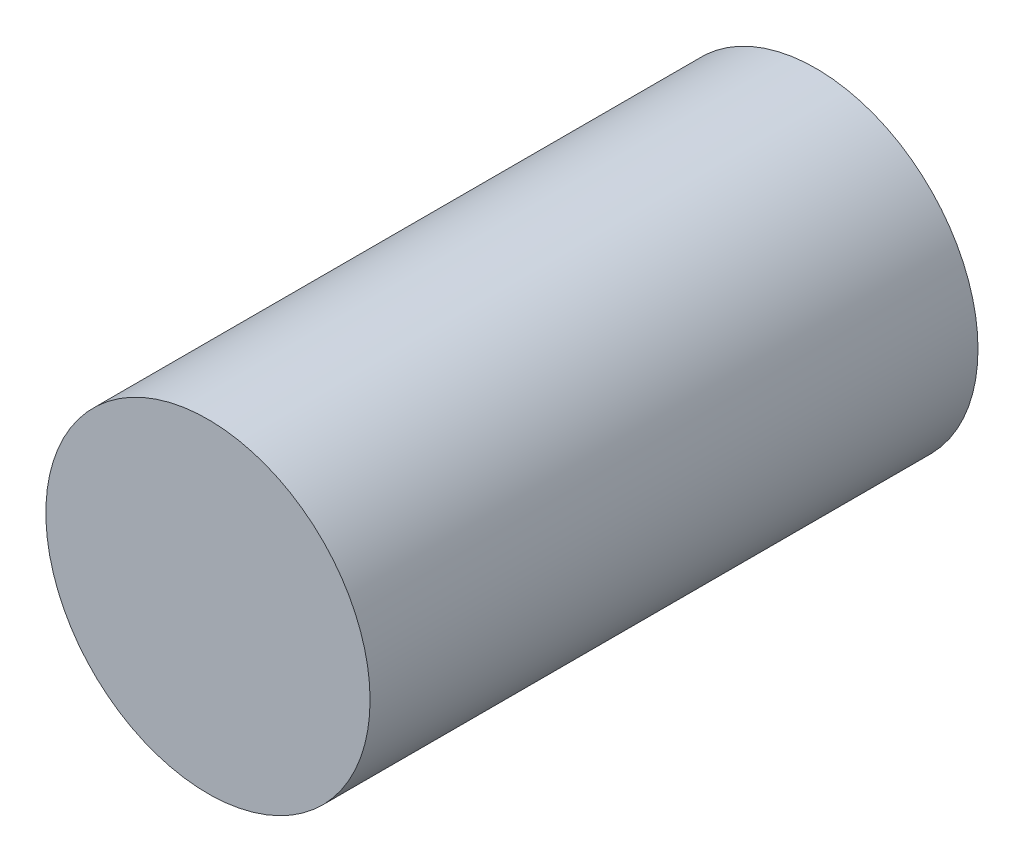
ISO-10303-21;
HEADER;
FILE_DESCRIPTION(('STEP AP214'),'2;1');
FILE_NAME('part.step','',(''),(''),'','','');
FILE_SCHEMA(('AUTOMOTIVE_DESIGN { 1 0 10303 214 1 1 1 1 }'));
ENDSEC;
DATA;
#1=APPLICATION_CONTEXT('core data for automotive mechanical design processes');
#2=APPLICATION_PROTOCOL_DEFINITION('international standard','automotive_design',2000,#1);
#3=PRODUCT_CONTEXT('',#1,'mechanical');
#4=PRODUCT('Part','Part','',(#3));
#5=PRODUCT_RELATED_PRODUCT_CATEGORY('part','',(#4));
#6=PRODUCT_DEFINITION_FORMATION('','',#4);
#7=PRODUCT_DEFINITION_CONTEXT('part definition',#1,'design');
#8=PRODUCT_DEFINITION('design','',#6,#7);
#9=PRODUCT_DEFINITION_SHAPE('','',#8);
#10=(LENGTH_UNIT() NAMED_UNIT(*) SI_UNIT(.MILLI.,.METRE.));
#11=(NAMED_UNIT(*) PLANE_ANGLE_UNIT() SI_UNIT($,.RADIAN.));
#12=(NAMED_UNIT(*) SI_UNIT($,.STERADIAN.) SOLID_ANGLE_UNIT());
#13=UNCERTAINTY_MEASURE_WITH_UNIT(LENGTH_MEASURE(1.E-05),#10,'distance_accuracy_value','');
#14=(GEOMETRIC_REPRESENTATION_CONTEXT(3) GLOBAL_UNCERTAINTY_ASSIGNED_CONTEXT((#13)) GLOBAL_UNIT_ASSIGNED_CONTEXT((#10,
#11,#12)) REPRESENTATION_CONTEXT('',''));
#15=CARTESIAN_POINT('',(0.,0.,0.));
#16=DIRECTION('',(0.,0.,1.));
#17=DIRECTION('',(1.,0.,0.));
#18=AXIS2_PLACEMENT_3D('',#15,#16,#17);
#19=CARTESIAN_POINT('',(0.,0.,150.));
#20=DIRECTION('',(0.,0.,-1.));
#21=DIRECTION('',(-1.,0.,0.));
#22=AXIS2_PLACEMENT_3D('',#19,#20,#21);
#23=CYLINDRICAL_SURFACE('',#22,40.);
#24=CARTESIAN_POINT('',(0.,0.,150.));
#25=DIRECTION('',(0.,0.,1.));
#26=DIRECTION('',(1.,0.,0.));
#27=AXIS2_PLACEMENT_3D('',#24,#25,#26);
#28=CIRCLE('',#27,40.);
#29=CARTESIAN_POINT('',(40.,0.,150.));
#30=VERTEX_POINT('',#29);
#31=EDGE_CURVE('E10',#30,#30,#28,.T.);
#32=ORIENTED_EDGE('',*,*,#31,.F.);
#33=EDGE_LOOP('',(#32));
#34=FACE_BOUND('',#33,.T.);
#35=CARTESIAN_POINT('',(0.,0.,0.));
#36=DIRECTION('',(0.,0.,1.));
#37=DIRECTION('',(1.,0.,0.));
#38=AXIS2_PLACEMENT_3D('',#35,#36,#37);
#39=CIRCLE('',#38,40.);
#40=CARTESIAN_POINT('',(40.,0.,0.));
#41=VERTEX_POINT('',#40);
#42=EDGE_CURVE('E42',#41,#41,#39,.T.);
#43=ORIENTED_EDGE('',*,*,#42,.T.);
#44=EDGE_LOOP('',(#43));
#45=FACE_BOUND('',#44,.T.);
#46=ADVANCED_FACE('F39',(#34,#45),#23,.T.);
#47=CARTESIAN_POINT('',(0.,0.,150.));
#48=DIRECTION('',(0.,0.,1.));
#49=DIRECTION('',(1.,0.,0.));
#50=AXIS2_PLACEMENT_3D('',#47,#48,#49);
#51=PLANE('',#50);
#52=ORIENTED_EDGE('',*,*,#31,.T.);
#53=EDGE_LOOP('',(#52));
#54=FACE_BOUND('',#53,.T.);
#55=ADVANCED_FACE('F56',(#54),#51,.T.);
#56=CARTESIAN_POINT('',(0.,0.,0.));
#57=DIRECTION('',(0.,0.,1.));
#58=DIRECTION('',(1.,0.,0.));
#59=AXIS2_PLACEMENT_3D('',#56,#57,#58);
#60=PLANE('',#59);
#61=ORIENTED_EDGE('',*,*,#42,.F.);
#62=EDGE_LOOP('',(#61));
#63=FACE_BOUND('',#62,.T.);
#64=ADVANCED_FACE('F54',(#63),#60,.F.);
#65=CLOSED_SHELL('',(#46,#55,#64));
#66=MANIFOLD_SOLID_BREP('B2',#65);
#67=ADVANCED_BREP_SHAPE_REPRESENTATION('',(#18,#66),#14);
#68=SHAPE_DEFINITION_REPRESENTATION(#9,#67);
ENDSEC;
END-ISO-10303-21;
